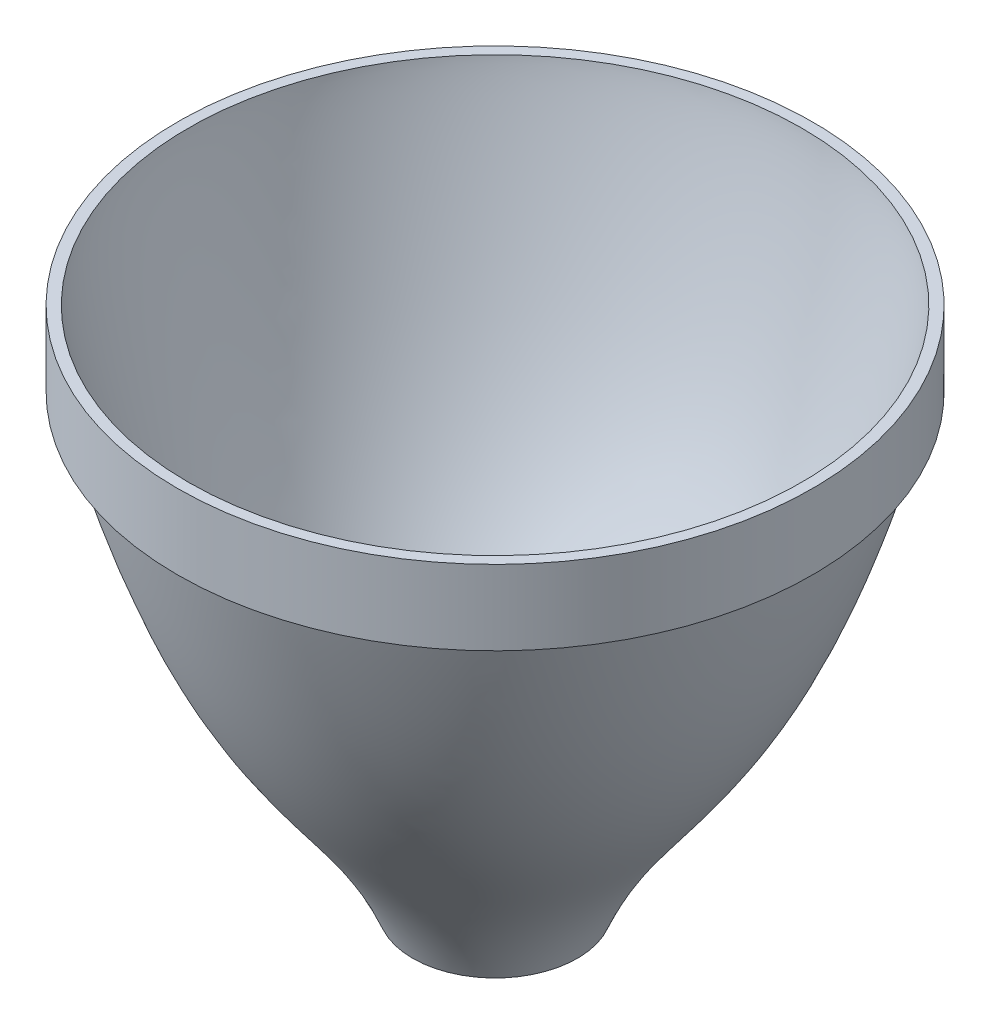
ISO-10303-21;
HEADER;
FILE_DESCRIPTION(('STEP AP214'),'2;1');
FILE_NAME('part.step','',(''),(''),'','','');
FILE_SCHEMA(('AUTOMOTIVE_DESIGN { 1 0 10303 214 1 1 1 1 }'));
ENDSEC;
DATA;
#1=APPLICATION_CONTEXT('core data for automotive mechanical design processes');
#2=APPLICATION_PROTOCOL_DEFINITION('international standard','automotive_design',2000,#1);
#3=PRODUCT_CONTEXT('',#1,'mechanical');
#4=PRODUCT('Part','Part','',(#3));
#5=PRODUCT_RELATED_PRODUCT_CATEGORY('part','',(#4));
#6=PRODUCT_DEFINITION_FORMATION('','',#4);
#7=PRODUCT_DEFINITION_CONTEXT('part definition',#1,'design');
#8=PRODUCT_DEFINITION('design','',#6,#7);
#9=PRODUCT_DEFINITION_SHAPE('','',#8);
#10=(LENGTH_UNIT() NAMED_UNIT(*) SI_UNIT(.MILLI.,.METRE.));
#11=(NAMED_UNIT(*) PLANE_ANGLE_UNIT() SI_UNIT($,.RADIAN.));
#12=(NAMED_UNIT(*) SI_UNIT($,.STERADIAN.) SOLID_ANGLE_UNIT());
#13=UNCERTAINTY_MEASURE_WITH_UNIT(LENGTH_MEASURE(1.E-05),#10,'distance_accuracy_value','');
#14=(GEOMETRIC_REPRESENTATION_CONTEXT(3) GLOBAL_UNCERTAINTY_ASSIGNED_CONTEXT((#13)) GLOBAL_UNIT_ASSIGNED_CONTEXT((#10,
#11,#12)) REPRESENTATION_CONTEXT('',''));
#15=CARTESIAN_POINT('',(0.,0.,0.));
#16=DIRECTION('',(0.,0.,1.));
#17=DIRECTION('',(1.,0.,0.));
#18=AXIS2_PLACEMENT_3D('',#15,#16,#17);
#19=CARTESIAN_POINT('',(-2.66578753626595,133.127421260354,0.));
#20=CARTESIAN_POINT('',(-2.32885169645018,130.569766041467,0.));
#21=CARTESIAN_POINT('',(5.81689344999003,99.9376670478013,0.));
#22=CARTESIAN_POINT('',(14.3450906200948,97.6991976695105,0.));
#23=CARTESIAN_POINT('',(18.8342124637341,86.673573080168,0.));
#24=B_SPLINE_CURVE_WITH_KNOTS('',3,(#19,#20,#21,#22,#23),.UNSPECIFIED.,.F.,.F.,(4,1,4),(0.,
0.272542359278829,1.),.UNSPECIFIED.);
#25=CARTESIAN_POINT('',(24.834212463734,148.471380654833,0.));
#26=DIRECTION('',(0.,1.,0.));
#27=AXIS1_PLACEMENT('',#25,#26);
#28=SURFACE_OF_REVOLUTION('',#24,#27);
#29=CARTESIAN_POINT('',(24.834212463734,86.673573080168,0.));
#30=DIRECTION('',(0.,1.,0.));
#31=DIRECTION('',(0.,0.,1.));
#32=AXIS2_PLACEMENT_3D('',#29,#30,#31);
#33=CIRCLE('',#32,5.99999999999999);
#34=CARTESIAN_POINT('',(24.834212463734,86.673573080168,5.99999999999999));
#35=VERTEX_POINT('',#34);
#36=EDGE_CURVE('E67',#35,#35,#33,.T.);
#37=ORIENTED_EDGE('',*,*,#36,.F.);
#38=EDGE_LOOP('',(#37));
#39=FACE_BOUND('',#38,.T.);
#40=CARTESIAN_POINT('',(24.834212463734,133.127421260354,0.));
#41=DIRECTION('',(0.,1.,0.));
#42=DIRECTION('',(0.,0.,1.));
#43=AXIS2_PLACEMENT_3D('',#40,#41,#42);
#44=CIRCLE('',#43,27.5);
#45=CARTESIAN_POINT('',(24.834212463734,133.127421260354,27.5));
#46=VERTEX_POINT('',#45);
#47=EDGE_CURVE('E10',#46,#46,#44,.T.);
#48=ORIENTED_EDGE('',*,*,#47,.T.);
#49=EDGE_LOOP('',(#48));
#50=FACE_BOUND('',#49,.T.);
#51=ADVANCED_FACE('F39',(#39,#50),#28,.T.);
#52=CARTESIAN_POINT('',(0.,133.127421260354,0.));
#53=DIRECTION('',(0.,1.,0.));
#54=DIRECTION('',(0.,0.,1.));
#55=AXIS2_PLACEMENT_3D('',#52,#53,#54);
#56=PLANE('',#55);
#57=CARTESIAN_POINT('',(24.834212463734,133.127421260354,0.));
#58=DIRECTION('',(0.,1.,0.));
#59=DIRECTION('',(0.,0.,1.));
#60=AXIS2_PLACEMENT_3D('',#57,#58,#59);
#61=CIRCLE('',#60,28.4667675536929);
#62=CARTESIAN_POINT('',(24.834212463734,133.127421260354,28.4667675536929));
#63=VERTEX_POINT('',#62);
#64=EDGE_CURVE('E47',#63,#63,#61,.T.);
#65=ORIENTED_EDGE('',*,*,#64,.T.);
#66=EDGE_LOOP('',(#65));
#67=FACE_BOUND('',#66,.T.);
#68=ORIENTED_EDGE('',*,*,#47,.F.);
#69=EDGE_LOOP('',(#68));
#70=FACE_BOUND('',#69,.T.);
#71=ADVANCED_FACE('F93',(#67,#70),#56,.T.);
#72=CARTESIAN_POINT('',(24.834212463734,148.471380654833,0.));
#73=DIRECTION('',(0.,1.,0.));
#74=DIRECTION('',(0.,0.,1.));
#75=AXIS2_PLACEMENT_3D('',#72,#73,#74);
#76=CYLINDRICAL_SURFACE('',#75,28.4667675536929);
#77=CARTESIAN_POINT('',(24.834212463734,126.417423779342,0.));
#78=DIRECTION('',(0.,1.,0.));
#79=DIRECTION('',(0.,0.,1.));
#80=AXIS2_PLACEMENT_3D('',#77,#78,#79);
#81=CIRCLE('',#80,28.4667675536929);
#82=CARTESIAN_POINT('',(24.834212463734,126.417423779342,28.4667675536929));
#83=VERTEX_POINT('',#82);
#84=EDGE_CURVE('E52',#83,#83,#81,.T.);
#85=ORIENTED_EDGE('',*,*,#84,.T.);
#86=EDGE_LOOP('',(#85));
#87=FACE_BOUND('',#86,.T.);
#88=ORIENTED_EDGE('',*,*,#64,.F.);
#89=EDGE_LOOP('',(#88));
#90=FACE_BOUND('',#89,.T.);
#91=ADVANCED_FACE('F90',(#87,#90),#76,.T.);
#92=CARTESIAN_POINT('',(0.,126.417423779342,0.));
#93=DIRECTION('',(0.,1.,0.));
#94=DIRECTION('',(0.,0.,1.));
#95=AXIS2_PLACEMENT_3D('',#92,#93,#94);
#96=PLANE('',#95);
#97=ORIENTED_EDGE('',*,*,#84,.F.);
#98=EDGE_LOOP('',(#97));
#99=FACE_BOUND('',#98,.T.);
#100=CARTESIAN_POINT('',(24.834212463734,126.417423779342,0.));
#101=DIRECTION('',(0.,1.,0.));
#102=DIRECTION('',(0.,0.,1.));
#103=AXIS2_PLACEMENT_3D('',#100,#101,#102);
#104=CIRCLE('',#103,27.5);
#105=CARTESIAN_POINT('',(24.834212463734,126.417423779342,27.5));
#106=VERTEX_POINT('',#105);
#107=EDGE_CURVE('E57',#106,#106,#104,.T.);
#108=ORIENTED_EDGE('',*,*,#107,.T.);
#109=EDGE_LOOP('',(#108));
#110=FACE_BOUND('',#109,.T.);
#111=ADVANCED_FACE('F86',(#99,#110),#96,.F.);
#112=CARTESIAN_POINT('',(-4.15293871009099,132.931509580787,0.));
#113=CARTESIAN_POINT('',(-4.1286008219861,132.746762459311,0.));
#114=CARTESIAN_POINT('',(-4.07445963191948,132.399645037455,0.));
#115=CARTESIAN_POINT('',(-3.91557470707325,131.539845483536,0.));
#116=CARTESIAN_POINT('',(-3.64006891123624,130.26478494295,0.));
#117=CARTESIAN_POINT('',(-3.23915677072509,128.605923010817,0.));
#118=CARTESIAN_POINT('',(-2.85138033671544,127.106130829012,0.));
#119=CARTESIAN_POINT('',(-2.27243476591265,124.95343104764,0.));
#120=CARTESIAN_POINT('',(-1.31666969828609,121.621801518192,0.));
#121=CARTESIAN_POINT('',(0.153966793747553,117.002853190748,0.));
#122=CARTESIAN_POINT('',(1.73655041871746,112.70606711043,0.));
#123=CARTESIAN_POINT('',(3.85038004061254,107.834931953136,0.));
#124=CARTESIAN_POINT('',(6.50608340028771,103.005558511118,0.));
#125=CARTESIAN_POINT('',(9.61322597844205,98.5782136612445,0.));
#126=CARTESIAN_POINT('',(12.028471384426,95.4514996336465,0.));
#127=CARTESIAN_POINT('',(13.8206642467036,92.9255267128538,0.));
#128=CARTESIAN_POINT('',(15.0961346922951,90.9232132411419,0.));
#129=CARTESIAN_POINT('',(16.1073796602739,89.0730148958805,0.));
#130=CARTESIAN_POINT('',(16.8794080765795,87.4485566142618,0.));
#131=CARTESIAN_POINT('',(17.264508599132,86.5511098226782,0.));
#132=CARTESIAN_POINT('',(17.444950713078,86.1079302704689,0.));
#133=B_SPLINE_CURVE_WITH_KNOTS('',3,(#112,#113,#114,#115,#116,#117,#118,#119,#120,#121,#122,
#123,#124,#125,#126,#127,#128,#129,#130,#131,#132),.UNSPECIFIED.,.F.,.F.,(4,1,1,1,1,1,1,1,1,1,1,
1,1,1,1,1,1,1,4),(0.,0.015625,0.03125,0.0625,0.09375,0.115852970234565,0.131477970234565,0.1875,
0.25,0.3125,0.375,0.5,0.625,0.75,0.8125,0.875,0.9375,0.96875,1.),.UNSPECIFIED.);
#134=CARTESIAN_POINT('',(24.834212463734,148.471380654833,0.));
#135=DIRECTION('',(0.,1.,0.));
#136=AXIS1_PLACEMENT('',#134,#135);
#137=SURFACE_OF_REVOLUTION('',#133,#136);
#138=CARTESIAN_POINT('',(24.834212463734,86.107930270469,0.));
#139=DIRECTION('',(0.,1.,0.));
#140=DIRECTION('',(0.,0.,1.));
#141=AXIS2_PLACEMENT_3D('',#138,#139,#140);
#142=CIRCLE('',#141,7.389261750656);
#143=CARTESIAN_POINT('',(24.834212463734,86.107930270469,7.389261750656));
#144=VERTEX_POINT('',#143);
#145=EDGE_CURVE('E63',#144,#144,#142,.T.);
#146=ORIENTED_EDGE('',*,*,#145,.T.);
#147=EDGE_LOOP('',(#146));
#148=FACE_BOUND('',#147,.T.);
#149=ORIENTED_EDGE('',*,*,#107,.F.);
#150=EDGE_LOOP('',(#149));
#151=FACE_BOUND('',#150,.T.);
#152=ADVANCED_FACE('F81',(#148,#151),#137,.F.);
#153=CARTESIAN_POINT('',(24.834212463734,86.673573080168,0.));
#154=DIRECTION('',(0.,-1.,0.));
#155=DIRECTION('',(0.,0.,-1.));
#156=AXIS2_PLACEMENT_3D('',#153,#154,#155);
#157=CONICAL_SURFACE('',#156,5.99999999999999,1.18413837557585);
#158=ORIENTED_EDGE('',*,*,#145,.F.);
#159=EDGE_LOOP('',(#158));
#160=FACE_BOUND('',#159,.T.);
#161=ORIENTED_EDGE('',*,*,#36,.T.);
#162=EDGE_LOOP('',(#161));
#163=FACE_BOUND('',#162,.T.);
#164=ADVANCED_FACE('F85',(#160,#163),#157,.F.);
#165=CLOSED_SHELL('',(#51,#71,#91,#111,#152,#164));
#166=MANIFOLD_SOLID_BREP('B2',#165);
#167=ADVANCED_BREP_SHAPE_REPRESENTATION('',(#18,#166),#14);
#168=SHAPE_DEFINITION_REPRESENTATION(#9,#167);
ENDSEC;
END-ISO-10303-21;
